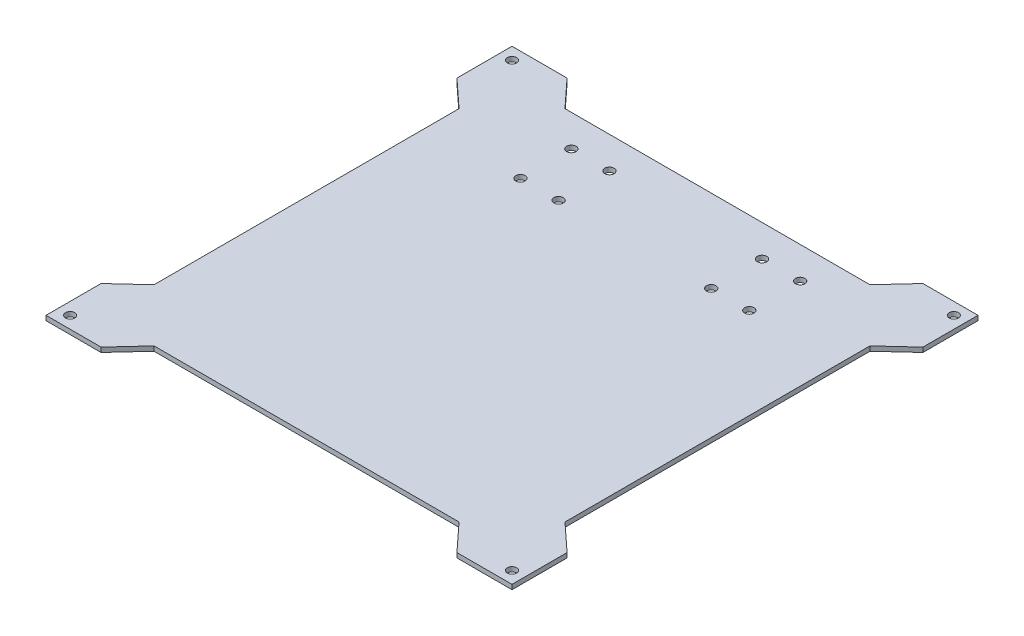
ISO-10303-21;
HEADER;
FILE_DESCRIPTION(('STEP AP214'),'2;1');
FILE_NAME('part.step','',(''),(''),'','','');
FILE_SCHEMA(('AUTOMOTIVE_DESIGN { 1 0 10303 214 1 1 1 1 }'));
ENDSEC;
DATA;
#1=APPLICATION_CONTEXT('core data for automotive mechanical design processes');
#2=APPLICATION_PROTOCOL_DEFINITION('international standard','automotive_design',2000,#1);
#3=PRODUCT_CONTEXT('',#1,'mechanical');
#4=PRODUCT('Part','Part','',(#3));
#5=PRODUCT_RELATED_PRODUCT_CATEGORY('part','',(#4));
#6=PRODUCT_DEFINITION_FORMATION('','',#4);
#7=PRODUCT_DEFINITION_CONTEXT('part definition',#1,'design');
#8=PRODUCT_DEFINITION('design','',#6,#7);
#9=PRODUCT_DEFINITION_SHAPE('','',#8);
#10=(LENGTH_UNIT() NAMED_UNIT(*) SI_UNIT(.MILLI.,.METRE.));
#11=(NAMED_UNIT(*) PLANE_ANGLE_UNIT() SI_UNIT($,.RADIAN.));
#12=(NAMED_UNIT(*) SI_UNIT($,.STERADIAN.) SOLID_ANGLE_UNIT());
#13=UNCERTAINTY_MEASURE_WITH_UNIT(LENGTH_MEASURE(1.E-05),#10,'distance_accuracy_value','');
#14=(GEOMETRIC_REPRESENTATION_CONTEXT(3) GLOBAL_UNCERTAINTY_ASSIGNED_CONTEXT((#13)) GLOBAL_UNIT_ASSIGNED_CONTEXT((#10,
#11,#12)) REPRESENTATION_CONTEXT('',''));
#15=CARTESIAN_POINT('',(0.,0.,0.));
#16=DIRECTION('',(0.,0.,1.));
#17=DIRECTION('',(1.,0.,0.));
#18=AXIS2_PLACEMENT_3D('',#15,#16,#17);
#19=CARTESIAN_POINT('',(-57.8146964856229,2.2,-53.3674121405761));
#20=DIRECTION('',(0.734803444627481,0.,0.678280102733073));
#21=DIRECTION('',(0.678280102733073,0.,-0.734803444627481));
#22=AXIS2_PLACEMENT_3D('',#19,#20,#21);
#23=PLANE('',#22);
#24=DIRECTION('',(-0.678280102733073,0.,0.734803444627481));
#25=VECTOR('',#24,1.);
#26=CARTESIAN_POINT('',(-57.8146964856229,0.,-53.3674121405761));
#27=LINE('',#26,#25);
#28=CARTESIAN_POINT('',(84.0000000000012,0.,-206.999999999999));
#29=VERTEX_POINT('',#28);
#30=CARTESIAN_POINT('',(72.0000000000011,0.,-193.999999999999));
#31=VERTEX_POINT('',#30);
#32=EDGE_CURVE('E231',#29,#31,#27,.T.);
#33=ORIENTED_EDGE('',*,*,#32,.T.);
#34=DIRECTION('',(0.,-1.,0.));
#35=VECTOR('',#34,1.);
#36=CARTESIAN_POINT('',(72.0000000000011,2.2,-193.999999999999));
#37=LINE('',#36,#35);
#38=CARTESIAN_POINT('',(72.0000000000011,2.2,-193.999999999999));
#39=VERTEX_POINT('',#38);
#40=EDGE_CURVE('E11',#39,#31,#37,.T.);
#41=ORIENTED_EDGE('',*,*,#40,.F.);
#42=DIRECTION('',(-0.678280102733073,0.,0.734803444627481));
#43=VECTOR('',#42,1.);
#44=CARTESIAN_POINT('',(-57.8146964856229,2.2,-53.3674121405761));
#45=LINE('',#44,#43);
#46=CARTESIAN_POINT('',(84.0000000000012,2.2,-206.999999999999));
#47=VERTEX_POINT('',#46);
#48=EDGE_CURVE('E428',#47,#39,#45,.T.);
#49=ORIENTED_EDGE('',*,*,#48,.F.);
#50=DIRECTION('',(0.,-1.,0.));
#51=VECTOR('',#50,1.);
#52=CARTESIAN_POINT('',(84.0000000000012,2.2,-206.999999999999));
#53=LINE('',#52,#51);
#54=EDGE_CURVE('E210',#47,#29,#53,.T.);
#55=ORIENTED_EDGE('',*,*,#54,.T.);
#56=EDGE_LOOP('',(#33,#41,#49,#55));
#57=FACE_BOUND('',#56,.T.);
#58=ADVANCED_FACE('F40',(#57),#23,.F.);
#59=CARTESIAN_POINT('',(2.09400398255688E-12,2.2,-194.));
#60=DIRECTION('',(0.,0.,1.));
#61=DIRECTION('',(1.,0.,0.));
#62=AXIS2_PLACEMENT_3D('',#59,#60,#61);
#63=PLANE('',#62);
#64=DIRECTION('',(-1.,0.,0.));
#65=VECTOR('',#64,1.);
#66=CARTESIAN_POINT('',(2.09400398255688E-12,0.,-194.));
#67=LINE('',#66,#65);
#68=CARTESIAN_POINT('',(-71.9999999999993,0.,-194.000000000001));
#69=VERTEX_POINT('',#68);
#70=EDGE_CURVE('E235',#31,#69,#67,.T.);
#71=ORIENTED_EDGE('',*,*,#70,.T.);
#72=DIRECTION('',(0.,-1.,0.));
#73=VECTOR('',#72,1.);
#74=CARTESIAN_POINT('',(-71.9999999999993,2.2,-194.000000000001));
#75=LINE('',#74,#73);
#76=CARTESIAN_POINT('',(-71.9999999999993,2.2,-194.000000000001));
#77=VERTEX_POINT('',#76);
#78=EDGE_CURVE('E50',#77,#69,#75,.T.);
#79=ORIENTED_EDGE('',*,*,#78,.F.);
#80=DIRECTION('',(-1.,0.,0.));
#81=VECTOR('',#80,1.);
#82=CARTESIAN_POINT('',(2.09400398255688E-12,2.2,-194.));
#83=LINE('',#82,#81);
#84=EDGE_CURVE('E137',#39,#77,#83,.T.);
#85=ORIENTED_EDGE('',*,*,#84,.F.);
#86=ORIENTED_EDGE('',*,*,#40,.T.);
#87=EDGE_LOOP('',(#71,#79,#85,#86));
#88=FACE_BOUND('',#87,.T.);
#89=ADVANCED_FACE('F443',(#88),#63,.F.);
#90=CARTESIAN_POINT('',(57.814696485623,2.2,-53.3674121405743));
#91=DIRECTION('',(-0.734803444627493,0.,0.67828010273306));
#92=DIRECTION('',(0.67828010273306,0.,0.734803444627493));
#93=AXIS2_PLACEMENT_3D('',#90,#91,#92);
#94=PLANE('',#93);
#95=DIRECTION('',(-0.67828010273306,0.,-0.734803444627493));
#96=VECTOR('',#95,1.);
#97=CARTESIAN_POINT('',(57.814696485623,0.,-53.3674121405743));
#98=LINE('',#97,#96);
#99=CARTESIAN_POINT('',(-83.9999999999992,0.,-207.000000000001));
#100=VERTEX_POINT('',#99);
#101=EDGE_CURVE('E238',#69,#100,#98,.T.);
#102=ORIENTED_EDGE('',*,*,#101,.T.);
#103=DIRECTION('',(0.,-1.,0.));
#104=VECTOR('',#103,1.);
#105=CARTESIAN_POINT('',(-83.9999999999992,2.2,-207.000000000001));
#106=LINE('',#105,#104);
#107=CARTESIAN_POINT('',(-83.9999999999992,2.2,-207.000000000001));
#108=VERTEX_POINT('',#107);
#109=EDGE_CURVE('E348',#108,#100,#106,.T.);
#110=ORIENTED_EDGE('',*,*,#109,.F.);
#111=DIRECTION('',(-0.67828010273306,0.,-0.734803444627493));
#112=VECTOR('',#111,1.);
#113=CARTESIAN_POINT('',(57.814696485623,2.2,-53.3674121405743));
#114=LINE('',#113,#112);
#115=EDGE_CURVE('E358',#77,#108,#114,.T.);
#116=ORIENTED_EDGE('',*,*,#115,.F.);
#117=ORIENTED_EDGE('',*,*,#78,.T.);
#118=EDGE_LOOP('',(#102,#110,#116,#117));
#119=FACE_BOUND('',#118,.T.);
#120=ADVANCED_FACE('F356',(#119),#94,.F.);
#121=CARTESIAN_POINT('',(1.32586249671581E-12,2.2,-207.));
#122=DIRECTION('',(0.,0.,1.));
#123=DIRECTION('',(1.,0.,0.));
#124=AXIS2_PLACEMENT_3D('',#121,#122,#123);
#125=PLANE('',#124);
#126=DIRECTION('',(-1.,0.,0.));
#127=VECTOR('',#126,1.);
#128=CARTESIAN_POINT('',(1.32586249671581E-12,0.,-207.));
#129=LINE('',#128,#127);
#130=CARTESIAN_POINT('',(-109.999999999999,0.,-207.000000000001));
#131=VERTEX_POINT('',#130);
#132=EDGE_CURVE('E241',#100,#131,#129,.T.);
#133=ORIENTED_EDGE('',*,*,#132,.T.);
#134=DIRECTION('',(0.,-1.,0.));
#135=VECTOR('',#134,1.);
#136=CARTESIAN_POINT('',(-109.999999999999,2.2,-207.000000000001));
#137=LINE('',#136,#135);
#138=CARTESIAN_POINT('',(-109.999999999999,2.2,-207.000000000001));
#139=VERTEX_POINT('',#138);
#140=EDGE_CURVE('E344',#139,#131,#137,.T.);
#141=ORIENTED_EDGE('',*,*,#140,.F.);
#142=DIRECTION('',(-1.,0.,0.));
#143=VECTOR('',#142,1.);
#144=CARTESIAN_POINT('',(1.32586249671581E-12,2.2,-207.));
#145=LINE('',#144,#143);
#146=EDGE_CURVE('E377',#108,#139,#145,.T.);
#147=ORIENTED_EDGE('',*,*,#146,.F.);
#148=ORIENTED_EDGE('',*,*,#109,.T.);
#149=EDGE_LOOP('',(#133,#141,#147,#148));
#150=FACE_BOUND('',#149,.T.);
#151=ADVANCED_FACE('F367',(#150),#125,.F.);
#152=CARTESIAN_POINT('',(-110.000000000001,2.2,-8.21992047078247E-13));
#153=DIRECTION('',(1.,0.,0.));
#154=DIRECTION('',(0.,0.,-1.));
#155=AXIS2_PLACEMENT_3D('',#152,#153,#154);
#156=PLANE('',#155);
#157=DIRECTION('',(0.,0.,1.));
#158=VECTOR('',#157,1.);
#159=CARTESIAN_POINT('',(-110.000000000001,0.,-8.21992047078247E-13));
#160=LINE('',#159,#158);
#161=CARTESIAN_POINT('',(-109.999999999999,0.,-181.000000000001));
#162=VERTEX_POINT('',#161);
#163=EDGE_CURVE('E244',#131,#162,#160,.T.);
#164=ORIENTED_EDGE('',*,*,#163,.T.);
#165=DIRECTION('',(0.,-1.,0.));
#166=VECTOR('',#165,1.);
#167=CARTESIAN_POINT('',(-109.999999999999,2.2,-181.000000000001));
#168=LINE('',#167,#166);
#169=CARTESIAN_POINT('',(-109.999999999999,2.2,-181.000000000001));
#170=VERTEX_POINT('',#169);
#171=EDGE_CURVE('E340',#170,#162,#168,.T.);
#172=ORIENTED_EDGE('',*,*,#171,.F.);
#173=DIRECTION('',(0.,0.,1.));
#174=VECTOR('',#173,1.);
#175=CARTESIAN_POINT('',(-110.000000000001,2.2,-8.21992047078247E-13));
#176=LINE('',#175,#174);
#177=EDGE_CURVE('E373',#139,#170,#176,.T.);
#178=ORIENTED_EDGE('',*,*,#177,.F.);
#179=ORIENTED_EDGE('',*,*,#140,.T.);
#180=EDGE_LOOP('',(#164,#172,#178,#179));
#181=FACE_BOUND('',#180,.T.);
#182=ADVANCED_FACE('F371',(#181),#156,.F.);
#183=CARTESIAN_POINT('',(39.6038338658147,2.2,-42.9041533546319));
#184=DIRECTION('',(0.678280102733071,0.,-0.734803444627483));
#185=DIRECTION('',(-0.734803444627483,0.,-0.678280102733071));
#186=AXIS2_PLACEMENT_3D('',#183,#184,#185);
#187=PLANE('',#186);
#188=DIRECTION('',(0.734803444627483,0.,0.678280102733071));
#189=VECTOR('',#188,1.);
#190=CARTESIAN_POINT('',(39.6038338658147,0.,-42.9041533546319));
#191=LINE('',#190,#189);
#192=CARTESIAN_POINT('',(-96.9999999999995,0.,-169.000000000001));
#193=VERTEX_POINT('',#192);
#194=EDGE_CURVE('E247',#162,#193,#191,.T.);
#195=ORIENTED_EDGE('',*,*,#194,.T.);
#196=DIRECTION('',(0.,-1.,0.));
#197=VECTOR('',#196,1.);
#198=CARTESIAN_POINT('',(-96.9999999999995,2.2,-169.000000000001));
#199=LINE('',#198,#197);
#200=CARTESIAN_POINT('',(-96.9999999999995,2.2,-169.000000000001));
#201=VERTEX_POINT('',#200);
#202=EDGE_CURVE('E336',#201,#193,#199,.T.);
#203=ORIENTED_EDGE('',*,*,#202,.F.);
#204=DIRECTION('',(0.734803444627483,0.,0.678280102733071));
#205=VECTOR('',#204,1.);
#206=CARTESIAN_POINT('',(39.6038338658147,2.2,-42.9041533546319));
#207=LINE('',#206,#205);
#208=EDGE_CURVE('E376',#170,#201,#207,.T.);
#209=ORIENTED_EDGE('',*,*,#208,.F.);
#210=ORIENTED_EDGE('',*,*,#171,.T.);
#211=EDGE_LOOP('',(#195,#203,#209,#210));
#212=FACE_BOUND('',#211,.T.);
#213=ADVANCED_FACE('F836',(#212),#187,.F.);
#214=CARTESIAN_POINT('',(-97.0000000000007,2.2,-6.91769172808975E-13));
#215=DIRECTION('',(1.,0.,0.));
#216=DIRECTION('',(0.,0.,-1.));
#217=AXIS2_PLACEMENT_3D('',#214,#215,#216);
#218=PLANE('',#217);
#219=DIRECTION('',(0.,0.,1.));
#220=VECTOR('',#219,1.);
#221=CARTESIAN_POINT('',(-97.0000000000007,0.,-6.91769172808975E-13));
#222=LINE('',#221,#220);
#223=CARTESIAN_POINT('',(-97.0000000000002,0.,-25.0000000000004));
#224=VERTEX_POINT('',#223);
#225=EDGE_CURVE('E250',#193,#224,#222,.T.);
#226=ORIENTED_EDGE('',*,*,#225,.T.);
#227=DIRECTION('',(0.,-1.,0.));
#228=VECTOR('',#227,1.);
#229=CARTESIAN_POINT('',(-97.0000000000002,2.2,-25.0000000000004));
#230=LINE('',#229,#228);
#231=CARTESIAN_POINT('',(-97.0000000000002,2.2,-25.0000000000004));
#232=VERTEX_POINT('',#231);
#233=EDGE_CURVE('E332',#232,#224,#230,.T.);
#234=ORIENTED_EDGE('',*,*,#233,.F.);
#235=DIRECTION('',(0.,0.,1.));
#236=VECTOR('',#235,1.);
#237=CARTESIAN_POINT('',(-97.0000000000007,2.2,-6.91769172808975E-13));
#238=LINE('',#237,#236);
#239=EDGE_CURVE('E381',#201,#232,#238,.T.);
#240=ORIENTED_EDGE('',*,*,#239,.F.);
#241=ORIENTED_EDGE('',*,*,#202,.T.);
#242=EDGE_LOOP('',(#226,#234,#240,#241));
#243=FACE_BOUND('',#242,.T.);
#244=ADVANCED_FACE('F826',(#243),#218,.F.);
#245=CARTESIAN_POINT('',(-57.0862619808307,2.2,-61.8434504792336));
#246=DIRECTION('',(0.678280102733064,0.,0.73480344462749));
#247=DIRECTION('',(0.73480344462749,0.,-0.678280102733064));
#248=AXIS2_PLACEMENT_3D('',#245,#246,#247);
#249=PLANE('',#248);
#250=DIRECTION('',(-0.73480344462749,0.,0.678280102733064));
#251=VECTOR('',#250,1.);
#252=CARTESIAN_POINT('',(-57.0862619808307,0.,-61.8434504792336));
#253=LINE('',#252,#251);
#254=CARTESIAN_POINT('',(-110.,0.,-13.0000000000004));
#255=VERTEX_POINT('',#254);
#256=EDGE_CURVE('E253',#224,#255,#253,.T.);
#257=ORIENTED_EDGE('',*,*,#256,.T.);
#258=DIRECTION('',(0.,-1.,0.));
#259=VECTOR('',#258,1.);
#260=CARTESIAN_POINT('',(-110.,2.2,-13.0000000000004));
#261=LINE('',#260,#259);
#262=CARTESIAN_POINT('',(-110.,2.2,-13.0000000000004));
#263=VERTEX_POINT('',#262);
#264=EDGE_CURVE('E328',#263,#255,#261,.T.);
#265=ORIENTED_EDGE('',*,*,#264,.F.);
#266=DIRECTION('',(-0.73480344462749,0.,0.678280102733064));
#267=VECTOR('',#266,1.);
#268=CARTESIAN_POINT('',(-57.0862619808307,2.2,-61.8434504792336));
#269=LINE('',#268,#267);
#270=EDGE_CURVE('E388',#232,#263,#269,.T.);
#271=ORIENTED_EDGE('',*,*,#270,.F.);
#272=ORIENTED_EDGE('',*,*,#233,.T.);
#273=EDGE_LOOP('',(#257,#265,#271,#272));
#274=FACE_BOUND('',#273,.T.);
#275=ADVANCED_FACE('F816',(#274),#249,.F.);
#276=CARTESIAN_POINT('',(-110.,2.2,-4.10996023539122E-13));
#277=DIRECTION('',(1.,0.,0.));
#278=DIRECTION('',(0.,0.,-1.));
#279=AXIS2_PLACEMENT_3D('',#276,#277,#278);
#280=PLANE('',#279);
#281=DIRECTION('',(0.,0.,1.));
#282=VECTOR('',#281,1.);
#283=CARTESIAN_POINT('',(-110.,0.,-4.10996023539122E-13));
#284=LINE('',#283,#282);
#285=CARTESIAN_POINT('',(-110.,0.,12.9999999999996));
#286=VERTEX_POINT('',#285);
#287=EDGE_CURVE('E256',#255,#286,#284,.T.);
#288=ORIENTED_EDGE('',*,*,#287,.T.);
#289=DIRECTION('',(0.,-1.,0.));
#290=VECTOR('',#289,1.);
#291=CARTESIAN_POINT('',(-110.,2.2,12.9999999999996));
#292=LINE('',#291,#290);
#293=CARTESIAN_POINT('',(-110.,2.2,12.9999999999996));
#294=VERTEX_POINT('',#293);
#295=EDGE_CURVE('E324',#294,#286,#292,.T.);
#296=ORIENTED_EDGE('',*,*,#295,.F.);
#297=DIRECTION('',(0.,0.,1.));
#298=VECTOR('',#297,1.);
#299=CARTESIAN_POINT('',(-110.,2.2,-4.10996023539122E-13));
#300=LINE('',#299,#298);
#301=EDGE_CURVE('E391',#263,#294,#300,.T.);
#302=ORIENTED_EDGE('',*,*,#301,.F.);
#303=ORIENTED_EDGE('',*,*,#264,.T.);
#304=EDGE_LOOP('',(#288,#296,#302,#303));
#305=FACE_BOUND('',#304,.T.);
#306=ADVANCED_FACE('F806',(#305),#280,.F.);
#307=CARTESIAN_POINT('',(0.,2.2,13.));
#308=DIRECTION('',(0.,0.,-1.));
#309=DIRECTION('',(-1.,0.,0.));
#310=AXIS2_PLACEMENT_3D('',#307,#308,#309);
#311=PLANE('',#310);
#312=DIRECTION('',(1.,0.,0.));
#313=VECTOR('',#312,1.);
#314=CARTESIAN_POINT('',(0.,0.,13.));
#315=LINE('',#314,#313);
#316=CARTESIAN_POINT('',(-84.0000000000004,0.,12.9999999999997));
#317=VERTEX_POINT('',#316);
#318=EDGE_CURVE('E259',#286,#317,#315,.T.);
#319=ORIENTED_EDGE('',*,*,#318,.T.);
#320=DIRECTION('',(0.,-1.,0.));
#321=VECTOR('',#320,1.);
#322=CARTESIAN_POINT('',(-84.0000000000004,2.2,12.9999999999997));
#323=LINE('',#322,#321);
#324=CARTESIAN_POINT('',(-84.0000000000004,2.2,12.9999999999997));
#325=VERTEX_POINT('',#324);
#326=EDGE_CURVE('E320',#325,#317,#323,.T.);
#327=ORIENTED_EDGE('',*,*,#326,.F.);
#328=DIRECTION('',(1.,0.,0.));
#329=VECTOR('',#328,1.);
#330=CARTESIAN_POINT('',(0.,2.2,13.));
#331=LINE('',#330,#329);
#332=EDGE_CURVE('E394',#294,#325,#331,.T.);
#333=ORIENTED_EDGE('',*,*,#332,.F.);
#334=ORIENTED_EDGE('',*,*,#295,.T.);
#335=EDGE_LOOP('',(#319,#327,#333,#334));
#336=FACE_BOUND('',#335,.T.);
#337=ADVANCED_FACE('F796',(#336),#311,.F.);
#338=CARTESIAN_POINT('',(-38.8753993610223,2.2,-35.8849840255594));
#339=DIRECTION('',(-0.734803444627485,0.,-0.678280102733069));
#340=DIRECTION('',(-0.678280102733069,0.,0.734803444627485));
#341=AXIS2_PLACEMENT_3D('',#338,#339,#340);
#342=PLANE('',#341);
#343=DIRECTION('',(0.678280102733069,0.,-0.734803444627485));
#344=VECTOR('',#343,1.);
#345=CARTESIAN_POINT('',(-38.8753993610223,0.,-35.8849840255594));
#346=LINE('',#345,#344);
#347=CARTESIAN_POINT('',(-72.0000000000003,0.,-2.63677968348475E-13));
#348=VERTEX_POINT('',#347);
#349=EDGE_CURVE('E262',#317,#348,#346,.T.);
#350=ORIENTED_EDGE('',*,*,#349,.T.);
#351=DIRECTION('',(0.,-1.,0.));
#352=VECTOR('',#351,1.);
#353=CARTESIAN_POINT('',(-72.0000000000003,2.2,-2.63677968348475E-13));
#354=LINE('',#353,#352);
#355=CARTESIAN_POINT('',(-72.0000000000003,2.2,-2.63677968348475E-13));
#356=VERTEX_POINT('',#355);
#357=EDGE_CURVE('E316',#356,#348,#354,.T.);
#358=ORIENTED_EDGE('',*,*,#357,.F.);
#359=DIRECTION('',(0.678280102733069,0.,-0.734803444627485));
#360=VECTOR('',#359,1.);
#361=CARTESIAN_POINT('',(-38.8753993610223,2.2,-35.8849840255594));
#362=LINE('',#361,#360);
#363=EDGE_CURVE('E397',#325,#356,#362,.T.);
#364=ORIENTED_EDGE('',*,*,#363,.F.);
#365=ORIENTED_EDGE('',*,*,#326,.T.);
#366=EDGE_LOOP('',(#350,#358,#364,#365));
#367=FACE_BOUND('',#366,.T.);
#368=ADVANCED_FACE('F785',(#367),#342,.F.);
#369=CARTESIAN_POINT('',(0.,2.2,0.));
#370=DIRECTION('',(0.,0.,-1.));
#371=DIRECTION('',(-1.,0.,0.));
#372=AXIS2_PLACEMENT_3D('',#369,#370,#371);
#373=PLANE('',#372);
#374=DIRECTION('',(1.,0.,0.));
#375=VECTOR('',#374,1.);
#376=CARTESIAN_POINT('',(0.,0.,0.));
#377=LINE('',#376,#375);
#378=CARTESIAN_POINT('',(72.,0.,0.));
#379=VERTEX_POINT('',#378);
#380=EDGE_CURVE('E265',#348,#379,#377,.T.);
#381=ORIENTED_EDGE('',*,*,#380,.T.);
#382=DIRECTION('',(0.,-1.,0.));
#383=VECTOR('',#382,1.);
#384=CARTESIAN_POINT('',(72.,2.2,0.));
#385=LINE('',#384,#383);
#386=CARTESIAN_POINT('',(72.,2.2,0.));
#387=VERTEX_POINT('',#386);
#388=EDGE_CURVE('E312',#387,#379,#385,.T.);
#389=ORIENTED_EDGE('',*,*,#388,.F.);
#390=DIRECTION('',(1.,0.,0.));
#391=VECTOR('',#390,1.);
#392=CARTESIAN_POINT('',(0.,2.2,0.));
#393=LINE('',#392,#391);
#394=EDGE_CURVE('E400',#356,#387,#393,.T.);
#395=ORIENTED_EDGE('',*,*,#394,.F.);
#396=ORIENTED_EDGE('',*,*,#357,.T.);
#397=EDGE_LOOP('',(#381,#389,#395,#396));
#398=FACE_BOUND('',#397,.T.);
#399=ADVANCED_FACE('F775',(#398),#373,.F.);
#400=CARTESIAN_POINT('',(38.8753993610223,2.2,-35.8849840255591));
#401=DIRECTION('',(0.734803444627488,0.,-0.678280102733066));
#402=DIRECTION('',(-0.678280102733066,0.,-0.734803444627488));
#403=AXIS2_PLACEMENT_3D('',#400,#401,#402);
#404=PLANE('',#403);
#405=DIRECTION('',(0.678280102733066,0.,0.734803444627488));
#406=VECTOR('',#405,1.);
#407=CARTESIAN_POINT('',(38.8753993610223,0.,-35.8849840255591));
#408=LINE('',#407,#406);
#409=CARTESIAN_POINT('',(84.,0.,13.));
#410=VERTEX_POINT('',#409);
#411=EDGE_CURVE('E268',#379,#410,#408,.T.);
#412=ORIENTED_EDGE('',*,*,#411,.T.);
#413=DIRECTION('',(0.,-1.,0.));
#414=VECTOR('',#413,1.);
#415=CARTESIAN_POINT('',(84.,2.2,13.));
#416=LINE('',#415,#414);
#417=CARTESIAN_POINT('',(84.,2.2,13.));
#418=VERTEX_POINT('',#417);
#419=EDGE_CURVE('E308',#418,#410,#416,.T.);
#420=ORIENTED_EDGE('',*,*,#419,.F.);
#421=DIRECTION('',(0.678280102733066,0.,0.734803444627488));
#422=VECTOR('',#421,1.);
#423=CARTESIAN_POINT('',(38.8753993610223,2.2,-35.8849840255591));
#424=LINE('',#423,#422);
#425=EDGE_CURVE('E403',#387,#418,#424,.T.);
#426=ORIENTED_EDGE('',*,*,#425,.F.);
#427=ORIENTED_EDGE('',*,*,#388,.T.);
#428=EDGE_LOOP('',(#412,#420,#426,#427));
#429=FACE_BOUND('',#428,.T.);
#430=ADVANCED_FACE('F765',(#429),#404,.F.);
#431=CARTESIAN_POINT('',(0.,2.2,13.));
#432=DIRECTION('',(0.,0.,-1.));
#433=DIRECTION('',(-1.,0.,0.));
#434=AXIS2_PLACEMENT_3D('',#431,#432,#433);
#435=PLANE('',#434);
#436=DIRECTION('',(1.,0.,0.));
#437=VECTOR('',#436,1.);
#438=CARTESIAN_POINT('',(0.,0.,13.));
#439=LINE('',#438,#437);
#440=CARTESIAN_POINT('',(110.,0.,13.));
#441=VERTEX_POINT('',#440);
#442=EDGE_CURVE('E271',#410,#441,#439,.T.);
#443=ORIENTED_EDGE('',*,*,#442,.T.);
#444=DIRECTION('',(0.,-1.,0.));
#445=VECTOR('',#444,1.);
#446=CARTESIAN_POINT('',(110.,2.2,13.));
#447=LINE('',#446,#445);
#448=CARTESIAN_POINT('',(110.,2.2,13.));
#449=VERTEX_POINT('',#448);
#450=EDGE_CURVE('E304',#449,#441,#447,.T.);
#451=ORIENTED_EDGE('',*,*,#450,.F.);
#452=DIRECTION('',(1.,0.,0.));
#453=VECTOR('',#452,1.);
#454=CARTESIAN_POINT('',(0.,2.2,13.));
#455=LINE('',#454,#453);
#456=EDGE_CURVE('E406',#418,#449,#455,.T.);
#457=ORIENTED_EDGE('',*,*,#456,.F.);
#458=ORIENTED_EDGE('',*,*,#419,.T.);
#459=EDGE_LOOP('',(#443,#451,#457,#458));
#460=FACE_BOUND('',#459,.T.);
#461=ADVANCED_FACE('F755',(#460),#435,.F.);
#462=CARTESIAN_POINT('',(110.,2.2,0.));
#463=DIRECTION('',(-1.,0.,0.));
#464=DIRECTION('',(0.,0.,1.));
#465=AXIS2_PLACEMENT_3D('',#462,#463,#464);
#466=PLANE('',#465);
#467=DIRECTION('',(0.,0.,-1.));
#468=VECTOR('',#467,1.);
#469=CARTESIAN_POINT('',(110.,0.,0.));
#470=LINE('',#469,#468);
#471=CARTESIAN_POINT('',(110.,0.,-13.));
#472=VERTEX_POINT('',#471);
#473=EDGE_CURVE('E274',#441,#472,#470,.T.);
#474=ORIENTED_EDGE('',*,*,#473,.T.);
#475=DIRECTION('',(0.,-1.,0.));
#476=VECTOR('',#475,1.);
#477=CARTESIAN_POINT('',(110.,2.2,-13.));
#478=LINE('',#477,#476);
#479=CARTESIAN_POINT('',(110.,2.2,-13.));
#480=VERTEX_POINT('',#479);
#481=EDGE_CURVE('E300',#480,#472,#478,.T.);
#482=ORIENTED_EDGE('',*,*,#481,.F.);
#483=DIRECTION('',(0.,0.,-1.));
#484=VECTOR('',#483,1.);
#485=CARTESIAN_POINT('',(110.,2.2,0.));
#486=LINE('',#485,#484);
#487=EDGE_CURVE('E409',#449,#480,#486,.T.);
#488=ORIENTED_EDGE('',*,*,#487,.F.);
#489=ORIENTED_EDGE('',*,*,#450,.T.);
#490=EDGE_LOOP('',(#474,#482,#488,#489));
#491=FACE_BOUND('',#490,.T.);
#492=ADVANCED_FACE('F746',(#491),#466,.F.);
#493=CARTESIAN_POINT('',(57.0862619808307,2.2,-61.8434504792332));
#494=DIRECTION('',(-0.678280102733066,0.,0.734803444627488));
#495=DIRECTION('',(0.734803444627488,0.,0.678280102733066));
#496=AXIS2_PLACEMENT_3D('',#493,#494,#495);
#497=PLANE('',#496);
#498=DIRECTION('',(-0.734803444627488,0.,-0.678280102733066));
#499=VECTOR('',#498,1.);
#500=CARTESIAN_POINT('',(57.0862619808307,0.,-61.8434504792332));
#501=LINE('',#500,#499);
#502=CARTESIAN_POINT('',(97.,0.,-25.));
#503=VERTEX_POINT('',#502);
#504=EDGE_CURVE('E277',#472,#503,#501,.T.);
#505=ORIENTED_EDGE('',*,*,#504,.T.);
#506=DIRECTION('',(0.,-1.,0.));
#507=VECTOR('',#506,1.);
#508=CARTESIAN_POINT('',(97.,2.2,-25.));
#509=LINE('',#508,#507);
#510=CARTESIAN_POINT('',(97.,2.2,-25.));
#511=VERTEX_POINT('',#510);
#512=EDGE_CURVE('E296',#511,#503,#509,.T.);
#513=ORIENTED_EDGE('',*,*,#512,.F.);
#514=DIRECTION('',(-0.734803444627488,0.,-0.678280102733066));
#515=VECTOR('',#514,1.);
#516=CARTESIAN_POINT('',(57.0862619808307,2.2,-61.8434504792332));
#517=LINE('',#516,#515);
#518=EDGE_CURVE('E412',#480,#511,#517,.T.);
#519=ORIENTED_EDGE('',*,*,#518,.F.);
#520=ORIENTED_EDGE('',*,*,#481,.T.);
#521=EDGE_LOOP('',(#505,#513,#519,#520));
#522=FACE_BOUND('',#521,.T.);
#523=ADVANCED_FACE('F420',(#522),#497,.F.);
#524=CARTESIAN_POINT('',(97.,2.2,0.));
#525=DIRECTION('',(-1.,0.,0.));
#526=DIRECTION('',(0.,0.,1.));
#527=AXIS2_PLACEMENT_3D('',#524,#525,#526);
#528=PLANE('',#527);
#529=DIRECTION('',(0.,0.,-1.));
#530=VECTOR('',#529,1.);
#531=CARTESIAN_POINT('',(97.,0.,0.));
#532=LINE('',#531,#530);
#533=CARTESIAN_POINT('',(97.0000000000008,0.,-168.999999999999));
#534=VERTEX_POINT('',#533);
#535=EDGE_CURVE('E280',#503,#534,#532,.T.);
#536=ORIENTED_EDGE('',*,*,#535,.T.);
#537=DIRECTION('',(0.,-1.,0.));
#538=VECTOR('',#537,1.);
#539=CARTESIAN_POINT('',(97.0000000000008,2.2,-168.999999999999));
#540=LINE('',#539,#538);
#541=CARTESIAN_POINT('',(97.0000000000008,2.2,-168.999999999999));
#542=VERTEX_POINT('',#541);
#543=EDGE_CURVE('E203',#542,#534,#540,.T.);
#544=ORIENTED_EDGE('',*,*,#543,.F.);
#545=DIRECTION('',(0.,0.,-1.));
#546=VECTOR('',#545,1.);
#547=CARTESIAN_POINT('',(97.,2.2,0.));
#548=LINE('',#547,#546);
#549=EDGE_CURVE('E192',#511,#542,#548,.T.);
#550=ORIENTED_EDGE('',*,*,#549,.F.);
#551=ORIENTED_EDGE('',*,*,#512,.T.);
#552=EDGE_LOOP('',(#536,#544,#550,#551));
#553=FACE_BOUND('',#552,.T.);
#554=ADVANCED_FACE('F424',(#553),#528,.F.);
#555=CARTESIAN_POINT('',(-39.6038338658148,2.2,-42.9041533546337));
#556=DIRECTION('',(-0.678280102733057,0.,-0.734803444627496));
#557=DIRECTION('',(-0.734803444627496,0.,0.678280102733057));
#558=AXIS2_PLACEMENT_3D('',#555,#556,#557);
#559=PLANE('',#558);
#560=DIRECTION('',(0.734803444627496,0.,-0.678280102733057));
#561=VECTOR('',#560,1.);
#562=CARTESIAN_POINT('',(-39.6038338658148,0.,-42.9041533546337));
#563=LINE('',#562,#561);
#564=CARTESIAN_POINT('',(110.000000000001,0.,-180.999999999999));
#565=VERTEX_POINT('',#564);
#566=EDGE_CURVE('E201',#534,#565,#563,.T.);
#567=ORIENTED_EDGE('',*,*,#566,.T.);
#568=DIRECTION('',(0.,-1.,0.));
#569=VECTOR('',#568,1.);
#570=CARTESIAN_POINT('',(110.000000000001,2.2,-180.999999999999));
#571=LINE('',#570,#569);
#572=CARTESIAN_POINT('',(110.000000000001,2.2,-180.999999999999));
#573=VERTEX_POINT('',#572);
#574=EDGE_CURVE('E198',#573,#565,#571,.T.);
#575=ORIENTED_EDGE('',*,*,#574,.F.);
#576=DIRECTION('',(0.734803444627496,0.,-0.678280102733057));
#577=VECTOR('',#576,1.);
#578=CARTESIAN_POINT('',(-39.6038338658148,2.2,-42.9041533546337));
#579=LINE('',#578,#577);
#580=EDGE_CURVE('E186',#542,#573,#579,.T.);
#581=ORIENTED_EDGE('',*,*,#580,.F.);
#582=ORIENTED_EDGE('',*,*,#543,.T.);
#583=EDGE_LOOP('',(#567,#575,#581,#582));
#584=FACE_BOUND('',#583,.T.);
#585=ADVANCED_FACE('F199',(#584),#559,.F.);
#586=CARTESIAN_POINT('',(109.999999999999,2.2,1.11556063532046E-12));
#587=DIRECTION('',(-1.,0.,0.));
#588=DIRECTION('',(0.,0.,1.));
#589=AXIS2_PLACEMENT_3D('',#586,#587,#588);
#590=PLANE('',#589);
#591=DIRECTION('',(0.,0.,-1.));
#592=VECTOR('',#591,1.);
#593=CARTESIAN_POINT('',(109.999999999999,0.,1.11556063532046E-12));
#594=LINE('',#593,#592);
#595=CARTESIAN_POINT('',(110.000000000001,0.,-206.999999999999));
#596=VERTEX_POINT('',#595);
#597=EDGE_CURVE('E123',#565,#596,#594,.T.);
#598=ORIENTED_EDGE('',*,*,#597,.T.);
#599=DIRECTION('',(0.,-1.,0.));
#600=VECTOR('',#599,1.);
#601=CARTESIAN_POINT('',(110.000000000001,2.2,-206.999999999999));
#602=LINE('',#601,#600);
#603=CARTESIAN_POINT('',(110.000000000001,2.2,-206.999999999999));
#604=VERTEX_POINT('',#603);
#605=EDGE_CURVE('E204',#604,#596,#602,.T.);
#606=ORIENTED_EDGE('',*,*,#605,.F.);
#607=DIRECTION('',(0.,0.,-1.));
#608=VECTOR('',#607,1.);
#609=CARTESIAN_POINT('',(109.999999999999,2.2,1.11556063532046E-12));
#610=LINE('',#609,#608);
#611=EDGE_CURVE('E190',#573,#604,#610,.T.);
#612=ORIENTED_EDGE('',*,*,#611,.F.);
#613=ORIENTED_EDGE('',*,*,#574,.T.);
#614=EDGE_LOOP('',(#598,#606,#612,#613));
#615=FACE_BOUND('',#614,.T.);
#616=ADVANCED_FACE('F206',(#615),#590,.F.);
#617=CARTESIAN_POINT('',(104.3,2.2,7.3));
#618=DIRECTION('',(0.,-1.,0.));
#619=DIRECTION('',(0.,0.,-1.));
#620=AXIS2_PLACEMENT_3D('',#617,#618,#619);
#621=CYLINDRICAL_SURFACE('',#620,2.20000000000001);
#622=CARTESIAN_POINT('',(104.3,2.2,7.3));
#623=DIRECTION('',(0.,1.,0.));
#624=DIRECTION('',(0.,0.,1.));
#625=AXIS2_PLACEMENT_3D('',#622,#623,#624);
#626=CIRCLE('',#625,2.20000000000001);
#627=CARTESIAN_POINT('',(104.3,2.2,9.50000000000001));
#628=VERTEX_POINT('',#627);
#629=EDGE_CURVE('E590',#628,#628,#626,.T.);
#630=ORIENTED_EDGE('',*,*,#629,.T.);
#631=EDGE_LOOP('',(#630));
#632=FACE_BOUND('',#631,.T.);
#633=CARTESIAN_POINT('',(104.3,0.,7.3));
#634=DIRECTION('',(0.,1.,0.));
#635=DIRECTION('',(0.,0.,1.));
#636=AXIS2_PLACEMENT_3D('',#633,#634,#635);
#637=CIRCLE('',#636,2.20000000000001);
#638=CARTESIAN_POINT('',(104.3,0.,9.50000000000001));
#639=VERTEX_POINT('',#638);
#640=EDGE_CURVE('E227',#639,#639,#637,.T.);
#641=ORIENTED_EDGE('',*,*,#640,.F.);
#642=EDGE_LOOP('',(#641));
#643=FACE_BOUND('',#642,.T.);
#644=ADVANCED_FACE('F451',(#632,#643),#621,.F.);
#645=CARTESIAN_POINT('',(-104.3,2.2,7.29999999999963));
#646=DIRECTION('',(0.,-1.,0.));
#647=DIRECTION('',(0.,0.,-1.));
#648=AXIS2_PLACEMENT_3D('',#645,#646,#647);
#649=CYLINDRICAL_SURFACE('',#648,2.20000000000001);
#650=CARTESIAN_POINT('',(-104.3,2.2,7.29999999999963));
#651=DIRECTION('',(0.,1.,0.));
#652=DIRECTION('',(0.,0.,1.));
#653=AXIS2_PLACEMENT_3D('',#650,#651,#652);
#654=CIRCLE('',#653,2.20000000000001);
#655=CARTESIAN_POINT('',(-104.3,2.2,9.49999999999964));
#656=VERTEX_POINT('',#655);
#657=EDGE_CURVE('E586',#656,#656,#654,.T.);
#658=ORIENTED_EDGE('',*,*,#657,.T.);
#659=EDGE_LOOP('',(#658));
#660=FACE_BOUND('',#659,.T.);
#661=CARTESIAN_POINT('',(-104.3,0.,7.29999999999963));
#662=DIRECTION('',(0.,1.,0.));
#663=DIRECTION('',(0.,0.,1.));
#664=AXIS2_PLACEMENT_3D('',#661,#662,#663);
#665=CIRCLE('',#664,2.20000000000001);
#666=CARTESIAN_POINT('',(-104.3,0.,9.49999999999964));
#667=VERTEX_POINT('',#666);
#668=EDGE_CURVE('E223',#667,#667,#665,.T.);
#669=ORIENTED_EDGE('',*,*,#668,.F.);
#670=EDGE_LOOP('',(#669));
#671=FACE_BOUND('',#670,.T.);
#672=ADVANCED_FACE('F454',(#660,#671),#649,.F.);
#673=CARTESIAN_POINT('',(-104.299999999999,2.2,-201.300000000001));
#674=DIRECTION('',(0.,-1.,0.));
#675=DIRECTION('',(0.,0.,-1.));
#676=AXIS2_PLACEMENT_3D('',#673,#674,#675);
#677=CYLINDRICAL_SURFACE('',#676,2.20000000000002);
#678=CARTESIAN_POINT('',(-104.299999999999,2.2,-201.300000000001));
#679=DIRECTION('',(0.,1.,0.));
#680=DIRECTION('',(0.,0.,1.));
#681=AXIS2_PLACEMENT_3D('',#678,#679,#680);
#682=CIRCLE('',#681,2.20000000000002);
#683=CARTESIAN_POINT('',(-104.299999999999,2.2,-199.100000000001));
#684=VERTEX_POINT('',#683);
#685=EDGE_CURVE('E465',#684,#684,#682,.T.);
#686=ORIENTED_EDGE('',*,*,#685,.T.);
#687=EDGE_LOOP('',(#686));
#688=FACE_BOUND('',#687,.T.);
#689=CARTESIAN_POINT('',(-104.299999999999,0.,-201.300000000001));
#690=DIRECTION('',(0.,1.,0.));
#691=DIRECTION('',(0.,0.,1.));
#692=AXIS2_PLACEMENT_3D('',#689,#690,#691);
#693=CIRCLE('',#692,2.20000000000002);
#694=CARTESIAN_POINT('',(-104.299999999999,0.,-199.100000000001));
#695=VERTEX_POINT('',#694);
#696=EDGE_CURVE('E218',#695,#695,#693,.T.);
#697=ORIENTED_EDGE('',*,*,#696,.F.);
#698=EDGE_LOOP('',(#697));
#699=FACE_BOUND('',#698,.T.);
#700=ADVANCED_FACE('F438',(#688,#699),#677,.F.);
#701=CARTESIAN_POINT('',(104.300000000001,2.2,-201.299999999999));
#702=DIRECTION('',(0.,-1.,0.));
#703=DIRECTION('',(0.,0.,-1.));
#704=AXIS2_PLACEMENT_3D('',#701,#702,#703);
#705=CYLINDRICAL_SURFACE('',#704,2.20000000000001);
#706=CARTESIAN_POINT('',(104.300000000001,2.2,-201.299999999999));
#707=DIRECTION('',(0.,1.,0.));
#708=DIRECTION('',(0.,0.,1.));
#709=AXIS2_PLACEMENT_3D('',#706,#707,#708);
#710=CIRCLE('',#709,2.20000000000001);
#711=CARTESIAN_POINT('',(104.300000000001,2.2,-199.099999999999));
#712=VERTEX_POINT('',#711);
#713=EDGE_CURVE('E289',#712,#712,#710,.T.);
#714=ORIENTED_EDGE('',*,*,#713,.T.);
#715=EDGE_LOOP('',(#714));
#716=FACE_BOUND('',#715,.T.);
#717=CARTESIAN_POINT('',(104.300000000001,0.,-201.299999999999));
#718=DIRECTION('',(0.,1.,0.));
#719=DIRECTION('',(0.,0.,1.));
#720=AXIS2_PLACEMENT_3D('',#717,#718,#719);
#721=CIRCLE('',#720,2.20000000000001);
#722=CARTESIAN_POINT('',(104.300000000001,0.,-199.099999999999));
#723=VERTEX_POINT('',#722);
#724=EDGE_CURVE('E214',#723,#723,#721,.T.);
#725=ORIENTED_EDGE('',*,*,#724,.F.);
#726=EDGE_LOOP('',(#725));
#727=FACE_BOUND('',#726,.T.);
#728=ADVANCED_FACE('F42',(#716,#727),#705,.F.);
#729=CARTESIAN_POINT('',(2.20977082785969E-12,2.2,-207.));
#730=DIRECTION('',(0.,0.,1.));
#731=DIRECTION('',(1.,0.,0.));
#732=AXIS2_PLACEMENT_3D('',#729,#730,#731);
#733=PLANE('',#732);
#734=DIRECTION('',(-1.,0.,0.));
#735=VECTOR('',#734,1.);
#736=CARTESIAN_POINT('',(2.20977082785969E-12,0.,-207.));
#737=LINE('',#736,#735);
#738=EDGE_CURVE('E129',#596,#29,#737,.T.);
#739=ORIENTED_EDGE('',*,*,#738,.T.);
#740=ORIENTED_EDGE('',*,*,#54,.F.);
#741=DIRECTION('',(-1.,0.,0.));
#742=VECTOR('',#741,1.);
#743=CARTESIAN_POINT('',(2.20977082785969E-12,2.2,-207.));
#744=LINE('',#743,#742);
#745=EDGE_CURVE('E58',#604,#47,#744,.T.);
#746=ORIENTED_EDGE('',*,*,#745,.F.);
#747=ORIENTED_EDGE('',*,*,#605,.T.);
#748=EDGE_LOOP('',(#739,#740,#746,#747));
#749=FACE_BOUND('',#748,.T.);
#750=ADVANCED_FACE('F429',(#749),#733,.F.);
#751=CARTESIAN_POINT('',(0.,2.2,0.));
#752=DIRECTION('',(0.,1.,0.));
#753=DIRECTION('',(0.,0.,1.));
#754=AXIS2_PLACEMENT_3D('',#751,#752,#753);
#755=PLANE('',#754);
#756=CARTESIAN_POINT('',(36.0249999999995,2.2,-155.025));
#757=DIRECTION('',(0.,1.,0.));
#758=DIRECTION('',(0.,0.,-1.));
#759=AXIS2_PLACEMENT_3D('',#756,#757,#758);
#760=CIRCLE('',#759,2.22499999999991);
#761=CARTESIAN_POINT('',(36.0249999999995,2.2,-157.25));
#762=VERTEX_POINT('',#761);
#763=EDGE_CURVE('E532',#762,#762,#760,.T.);
#764=ORIENTED_EDGE('',*,*,#763,.F.);
#765=EDGE_LOOP('',(#764));
#766=FACE_BOUND('',#765,.T.);
#767=CARTESIAN_POINT('',(-36.0249999999995,2.2,-155.024999999999));
#768=DIRECTION('',(0.,1.,0.));
#769=DIRECTION('',(0.,0.,1.));
#770=AXIS2_PLACEMENT_3D('',#767,#768,#769);
#771=CIRCLE('',#770,2.22499999999999);
#772=CARTESIAN_POINT('',(-36.0249999999995,2.2,-152.799999999999));
#773=VERTEX_POINT('',#772);
#774=EDGE_CURVE('E549',#773,#773,#771,.T.);
#775=ORIENTED_EDGE('',*,*,#774,.F.);
#776=EDGE_LOOP('',(#775));
#777=FACE_BOUND('',#776,.T.);
#778=CARTESIAN_POINT('',(-54.0249999999995,2.2,-155.024999999999));
#779=DIRECTION('',(0.,1.,0.));
#780=DIRECTION('',(0.,0.,1.));
#781=AXIS2_PLACEMENT_3D('',#778,#779,#780);
#782=CIRCLE('',#781,2.22499999999999);
#783=CARTESIAN_POINT('',(-54.0249999999995,2.2,-152.799999999999));
#784=VERTEX_POINT('',#783);
#785=EDGE_CURVE('E548',#784,#784,#782,.T.);
#786=ORIENTED_EDGE('',*,*,#785,.F.);
#787=EDGE_LOOP('',(#786));
#788=FACE_BOUND('',#787,.T.);
#789=CARTESIAN_POINT('',(-36.0249999999995,2.2,-179.024999999999));
#790=DIRECTION('',(0.,1.,0.));
#791=DIRECTION('',(0.,0.,1.));
#792=AXIS2_PLACEMENT_3D('',#789,#790,#791);
#793=CIRCLE('',#792,2.22499999999999);
#794=CARTESIAN_POINT('',(-36.0249999999995,2.2,-176.799999999999));
#795=VERTEX_POINT('',#794);
#796=EDGE_CURVE('E564',#795,#795,#793,.T.);
#797=ORIENTED_EDGE('',*,*,#796,.F.);
#798=EDGE_LOOP('',(#797));
#799=FACE_BOUND('',#798,.T.);
#800=CARTESIAN_POINT('',(54.0249999999995,2.2,-179.025));
#801=DIRECTION('',(0.,1.,0.));
#802=DIRECTION('',(0.,0.,-1.));
#803=AXIS2_PLACEMENT_3D('',#800,#801,#802);
#804=CIRCLE('',#803,2.22499999999784);
#805=CARTESIAN_POINT('',(54.0249999999995,2.2,-181.249999999998));
#806=VERTEX_POINT('',#805);
#807=EDGE_CURVE('E520',#806,#806,#804,.T.);
#808=ORIENTED_EDGE('',*,*,#807,.F.);
#809=EDGE_LOOP('',(#808));
#810=FACE_BOUND('',#809,.T.);
#811=CARTESIAN_POINT('',(36.0249999999995,2.2,-179.024999999999));
#812=DIRECTION('',(0.,1.,0.));
#813=DIRECTION('',(0.,0.,-1.));
#814=AXIS2_PLACEMENT_3D('',#811,#812,#813);
#815=CIRCLE('',#814,2.2249999999986);
#816=CARTESIAN_POINT('',(36.0249999999995,2.2,-181.249999999998));
#817=VERTEX_POINT('',#816);
#818=EDGE_CURVE('E525',#817,#817,#815,.T.);
#819=ORIENTED_EDGE('',*,*,#818,.F.);
#820=EDGE_LOOP('',(#819));
#821=FACE_BOUND('',#820,.T.);
#822=CARTESIAN_POINT('',(54.0249999999995,2.2,-155.025));
#823=DIRECTION('',(0.,1.,0.));
#824=DIRECTION('',(0.,0.,-1.));
#825=AXIS2_PLACEMENT_3D('',#822,#823,#824);
#826=CIRCLE('',#825,2.22499999999952);
#827=CARTESIAN_POINT('',(54.0249999999995,2.2,-157.25));
#828=VERTEX_POINT('',#827);
#829=EDGE_CURVE('E533',#828,#828,#826,.T.);
#830=ORIENTED_EDGE('',*,*,#829,.F.);
#831=EDGE_LOOP('',(#830));
#832=FACE_BOUND('',#831,.T.);
#833=CARTESIAN_POINT('',(-54.0249999999995,2.2,-179.024999999999));
#834=DIRECTION('',(0.,1.,0.));
#835=DIRECTION('',(0.,0.,1.));
#836=AXIS2_PLACEMENT_3D('',#833,#834,#835);
#837=CIRCLE('',#836,2.22499999999999);
#838=CARTESIAN_POINT('',(-54.0249999999995,2.2,-176.799999999999));
#839=VERTEX_POINT('',#838);
#840=EDGE_CURVE('E563',#839,#839,#837,.T.);
#841=ORIENTED_EDGE('',*,*,#840,.F.);
#842=EDGE_LOOP('',(#841));
#843=FACE_BOUND('',#842,.T.);
#844=ORIENTED_EDGE('',*,*,#713,.F.);
#845=EDGE_LOOP('',(#844));
#846=FACE_BOUND('',#845,.T.);
#847=ORIENTED_EDGE('',*,*,#685,.F.);
#848=EDGE_LOOP('',(#847));
#849=FACE_BOUND('',#848,.T.);
#850=ORIENTED_EDGE('',*,*,#657,.F.);
#851=EDGE_LOOP('',(#850));
#852=FACE_BOUND('',#851,.T.);
#853=ORIENTED_EDGE('',*,*,#629,.F.);
#854=EDGE_LOOP('',(#853));
#855=FACE_BOUND('',#854,.T.);
#856=ORIENTED_EDGE('',*,*,#48,.T.);
#857=ORIENTED_EDGE('',*,*,#84,.T.);
#858=ORIENTED_EDGE('',*,*,#115,.T.);
#859=ORIENTED_EDGE('',*,*,#146,.T.);
#860=ORIENTED_EDGE('',*,*,#177,.T.);
#861=ORIENTED_EDGE('',*,*,#208,.T.);
#862=ORIENTED_EDGE('',*,*,#239,.T.);
#863=ORIENTED_EDGE('',*,*,#270,.T.);
#864=ORIENTED_EDGE('',*,*,#301,.T.);
#865=ORIENTED_EDGE('',*,*,#332,.T.);
#866=ORIENTED_EDGE('',*,*,#363,.T.);
#867=ORIENTED_EDGE('',*,*,#394,.T.);
#868=ORIENTED_EDGE('',*,*,#425,.T.);
#869=ORIENTED_EDGE('',*,*,#456,.T.);
#870=ORIENTED_EDGE('',*,*,#487,.T.);
#871=ORIENTED_EDGE('',*,*,#518,.T.);
#872=ORIENTED_EDGE('',*,*,#549,.T.);
#873=ORIENTED_EDGE('',*,*,#580,.T.);
#874=ORIENTED_EDGE('',*,*,#611,.T.);
#875=ORIENTED_EDGE('',*,*,#745,.T.);
#876=EDGE_LOOP('',(#856,#857,#858,#859,#860,#861,#862,#863,#864,#865,#866,#867,#868,#869,#870,
#871,#872,#873,#874,#875));
#877=FACE_BOUND('',#876,.T.);
#878=ADVANCED_FACE('F188',(#766,#777,#788,#799,#810,#821,#832,#843,#846,#849,#852,#855,#877),
#755,.T.);
#879=CARTESIAN_POINT('',(0.,0.,0.));
#880=DIRECTION('',(0.,1.,0.));
#881=DIRECTION('',(0.,0.,1.));
#882=AXIS2_PLACEMENT_3D('',#879,#880,#881);
#883=PLANE('',#882);
#884=CARTESIAN_POINT('',(36.0249999999995,0.,-155.025));
#885=DIRECTION('',(0.,1.,0.));
#886=DIRECTION('',(0.,0.,-1.));
#887=AXIS2_PLACEMENT_3D('',#884,#885,#886);
#888=CIRCLE('',#887,2.22499999999991);
#889=CARTESIAN_POINT('',(36.0249999999995,0.,-157.25));
#890=VERTEX_POINT('',#889);
#891=EDGE_CURVE('E553',#890,#890,#888,.T.);
#892=ORIENTED_EDGE('',*,*,#891,.T.);
#893=EDGE_LOOP('',(#892));
#894=FACE_BOUND('',#893,.T.);
#895=CARTESIAN_POINT('',(-36.0249999999995,0.,-155.024999999999));
#896=DIRECTION('',(0.,1.,0.));
#897=DIRECTION('',(0.,0.,1.));
#898=AXIS2_PLACEMENT_3D('',#895,#896,#897);
#899=CIRCLE('',#898,2.22499999999999);
#900=CARTESIAN_POINT('',(-36.0249999999995,0.,-152.799999999999));
#901=VERTEX_POINT('',#900);
#902=EDGE_CURVE('E544',#901,#901,#899,.T.);
#903=ORIENTED_EDGE('',*,*,#902,.T.);
#904=EDGE_LOOP('',(#903));
#905=FACE_BOUND('',#904,.T.);
#906=CARTESIAN_POINT('',(-54.0249999999995,0.,-155.024999999999));
#907=DIRECTION('',(0.,1.,0.));
#908=DIRECTION('',(0.,0.,1.));
#909=AXIS2_PLACEMENT_3D('',#906,#907,#908);
#910=CIRCLE('',#909,2.22499999999999);
#911=CARTESIAN_POINT('',(-54.0249999999995,0.,-152.799999999999));
#912=VERTEX_POINT('',#911);
#913=EDGE_CURVE('E568',#912,#912,#910,.T.);
#914=ORIENTED_EDGE('',*,*,#913,.T.);
#915=EDGE_LOOP('',(#914));
#916=FACE_BOUND('',#915,.T.);
#917=CARTESIAN_POINT('',(-36.0249999999995,0.,-179.024999999999));
#918=DIRECTION('',(0.,1.,0.));
#919=DIRECTION('',(0.,0.,1.));
#920=AXIS2_PLACEMENT_3D('',#917,#918,#919);
#921=CIRCLE('',#920,2.22499999999999);
#922=CARTESIAN_POINT('',(-36.0249999999995,0.,-176.799999999999));
#923=VERTEX_POINT('',#922);
#924=EDGE_CURVE('E559',#923,#923,#921,.T.);
#925=ORIENTED_EDGE('',*,*,#924,.T.);
#926=EDGE_LOOP('',(#925));
#927=FACE_BOUND('',#926,.T.);
#928=CARTESIAN_POINT('',(54.0249999999995,0.,-179.025));
#929=DIRECTION('',(0.,1.,0.));
#930=DIRECTION('',(0.,0.,-1.));
#931=AXIS2_PLACEMENT_3D('',#928,#929,#930);
#932=CIRCLE('',#931,2.22499999999784);
#933=CARTESIAN_POINT('',(54.0249999999995,0.,-181.249999999998));
#934=VERTEX_POINT('',#933);
#935=EDGE_CURVE('E517',#934,#934,#932,.T.);
#936=ORIENTED_EDGE('',*,*,#935,.T.);
#937=EDGE_LOOP('',(#936));
#938=FACE_BOUND('',#937,.T.);
#939=CARTESIAN_POINT('',(36.0249999999995,0.,-179.024999999999));
#940=DIRECTION('',(0.,1.,0.));
#941=DIRECTION('',(0.,0.,-1.));
#942=AXIS2_PLACEMENT_3D('',#939,#940,#941);
#943=CIRCLE('',#942,2.2249999999986);
#944=CARTESIAN_POINT('',(36.0249999999995,0.,-181.249999999998));
#945=VERTEX_POINT('',#944);
#946=EDGE_CURVE('E537',#945,#945,#943,.T.);
#947=ORIENTED_EDGE('',*,*,#946,.T.);
#948=EDGE_LOOP('',(#947));
#949=FACE_BOUND('',#948,.T.);
#950=CARTESIAN_POINT('',(54.0249999999995,0.,-155.025));
#951=DIRECTION('',(0.,1.,0.));
#952=DIRECTION('',(0.,0.,-1.));
#953=AXIS2_PLACEMENT_3D('',#950,#951,#952);
#954=CIRCLE('',#953,2.22499999999952);
#955=CARTESIAN_POINT('',(54.0249999999995,0.,-157.25));
#956=VERTEX_POINT('',#955);
#957=EDGE_CURVE('E528',#956,#956,#954,.T.);
#958=ORIENTED_EDGE('',*,*,#957,.T.);
#959=EDGE_LOOP('',(#958));
#960=FACE_BOUND('',#959,.T.);
#961=CARTESIAN_POINT('',(-54.0249999999995,0.,-179.024999999999));
#962=DIRECTION('',(0.,1.,0.));
#963=DIRECTION('',(0.,0.,1.));
#964=AXIS2_PLACEMENT_3D('',#961,#962,#963);
#965=CIRCLE('',#964,2.22499999999999);
#966=CARTESIAN_POINT('',(-54.0249999999995,0.,-176.799999999999));
#967=VERTEX_POINT('',#966);
#968=EDGE_CURVE('E219',#967,#967,#965,.T.);
#969=ORIENTED_EDGE('',*,*,#968,.T.);
#970=EDGE_LOOP('',(#969));
#971=FACE_BOUND('',#970,.T.);
#972=ORIENTED_EDGE('',*,*,#724,.T.);
#973=EDGE_LOOP('',(#972));
#974=FACE_BOUND('',#973,.T.);
#975=ORIENTED_EDGE('',*,*,#696,.T.);
#976=EDGE_LOOP('',(#975));
#977=FACE_BOUND('',#976,.T.);
#978=ORIENTED_EDGE('',*,*,#668,.T.);
#979=EDGE_LOOP('',(#978));
#980=FACE_BOUND('',#979,.T.);
#981=ORIENTED_EDGE('',*,*,#640,.T.);
#982=EDGE_LOOP('',(#981));
#983=FACE_BOUND('',#982,.T.);
#984=ORIENTED_EDGE('',*,*,#32,.F.);
#985=ORIENTED_EDGE('',*,*,#738,.F.);
#986=ORIENTED_EDGE('',*,*,#597,.F.);
#987=ORIENTED_EDGE('',*,*,#566,.F.);
#988=ORIENTED_EDGE('',*,*,#535,.F.);
#989=ORIENTED_EDGE('',*,*,#504,.F.);
#990=ORIENTED_EDGE('',*,*,#473,.F.);
#991=ORIENTED_EDGE('',*,*,#442,.F.);
#992=ORIENTED_EDGE('',*,*,#411,.F.);
#993=ORIENTED_EDGE('',*,*,#380,.F.);
#994=ORIENTED_EDGE('',*,*,#349,.F.);
#995=ORIENTED_EDGE('',*,*,#318,.F.);
#996=ORIENTED_EDGE('',*,*,#287,.F.);
#997=ORIENTED_EDGE('',*,*,#256,.F.);
#998=ORIENTED_EDGE('',*,*,#225,.F.);
#999=ORIENTED_EDGE('',*,*,#194,.F.);
#1000=ORIENTED_EDGE('',*,*,#163,.F.);
#1001=ORIENTED_EDGE('',*,*,#132,.F.);
#1002=ORIENTED_EDGE('',*,*,#101,.F.);
#1003=ORIENTED_EDGE('',*,*,#70,.F.);
#1004=EDGE_LOOP('',(#984,#985,#986,#987,#988,#989,#990,#991,#992,#993,#994,#995,#996,#997,#998,
#999,#1000,#1001,#1002,#1003));
#1005=FACE_BOUND('',#1004,.T.);
#1006=ADVANCED_FACE('F362',(#894,#905,#916,#927,#938,#949,#960,#971,#974,#977,#980,#983,#1005),
#883,.F.);
#1007=CARTESIAN_POINT('',(-54.0249999999995,0.,-179.024999999999));
#1008=DIRECTION('',(0.,1.,0.));
#1009=DIRECTION('',(0.,0.,1.));
#1010=AXIS2_PLACEMENT_3D('',#1007,#1008,#1009);
#1011=CYLINDRICAL_SURFACE('',#1010,2.22499999999999);
#1012=ORIENTED_EDGE('',*,*,#968,.F.);
#1013=EDGE_LOOP('',(#1012));
#1014=FACE_BOUND('',#1013,.T.);
#1015=ORIENTED_EDGE('',*,*,#840,.T.);
#1016=EDGE_LOOP('',(#1015));
#1017=FACE_BOUND('',#1016,.T.);
#1018=ADVANCED_FACE('F470',(#1014,#1017),#1011,.F.);
#1019=CARTESIAN_POINT('',(54.0249999999995,0.,-155.025));
#1020=DIRECTION('',(0.,1.,0.));
#1021=DIRECTION('',(0.,0.,1.));
#1022=AXIS2_PLACEMENT_3D('',#1019,#1020,#1021);
#1023=CYLINDRICAL_SURFACE('',#1022,2.22499999999952);
#1024=ORIENTED_EDGE('',*,*,#957,.F.);
#1025=EDGE_LOOP('',(#1024));
#1026=FACE_BOUND('',#1025,.T.);
#1027=ORIENTED_EDGE('',*,*,#829,.T.);
#1028=EDGE_LOOP('',(#1027));
#1029=FACE_BOUND('',#1028,.T.);
#1030=ADVANCED_FACE('F480',(#1026,#1029),#1023,.F.);
#1031=CARTESIAN_POINT('',(36.0249999999995,0.,-179.024999999999));
#1032=DIRECTION('',(0.,1.,0.));
#1033=DIRECTION('',(0.,0.,1.));
#1034=AXIS2_PLACEMENT_3D('',#1031,#1032,#1033);
#1035=CYLINDRICAL_SURFACE('',#1034,2.2249999999986);
#1036=ORIENTED_EDGE('',*,*,#946,.F.);
#1037=EDGE_LOOP('',(#1036));
#1038=FACE_BOUND('',#1037,.T.);
#1039=ORIENTED_EDGE('',*,*,#818,.T.);
#1040=EDGE_LOOP('',(#1039));
#1041=FACE_BOUND('',#1040,.T.);
#1042=ADVANCED_FACE('F503',(#1038,#1041),#1035,.F.);
#1043=CARTESIAN_POINT('',(54.0249999999995,0.,-179.025));
#1044=DIRECTION('',(0.,1.,0.));
#1045=DIRECTION('',(0.,0.,1.));
#1046=AXIS2_PLACEMENT_3D('',#1043,#1044,#1045);
#1047=CYLINDRICAL_SURFACE('',#1046,2.22499999999784);
#1048=ORIENTED_EDGE('',*,*,#935,.F.);
#1049=EDGE_LOOP('',(#1048));
#1050=FACE_BOUND('',#1049,.T.);
#1051=ORIENTED_EDGE('',*,*,#807,.T.);
#1052=EDGE_LOOP('',(#1051));
#1053=FACE_BOUND('',#1052,.T.);
#1054=ADVANCED_FACE('F494',(#1050,#1053),#1047,.F.);
#1055=CARTESIAN_POINT('',(-36.0249999999995,0.,-179.024999999999));
#1056=DIRECTION('',(0.,1.,0.));
#1057=DIRECTION('',(0.,0.,1.));
#1058=AXIS2_PLACEMENT_3D('',#1055,#1056,#1057);
#1059=CYLINDRICAL_SURFACE('',#1058,2.22499999999999);
#1060=ORIENTED_EDGE('',*,*,#924,.F.);
#1061=EDGE_LOOP('',(#1060));
#1062=FACE_BOUND('',#1061,.T.);
#1063=ORIENTED_EDGE('',*,*,#796,.T.);
#1064=EDGE_LOOP('',(#1063));
#1065=FACE_BOUND('',#1064,.T.);
#1066=ADVANCED_FACE('F490',(#1062,#1065),#1059,.F.);
#1067=CARTESIAN_POINT('',(-54.0249999999995,0.,-155.024999999999));
#1068=DIRECTION('',(0.,1.,0.));
#1069=DIRECTION('',(0.,0.,1.));
#1070=AXIS2_PLACEMENT_3D('',#1067,#1068,#1069);
#1071=CYLINDRICAL_SURFACE('',#1070,2.22499999999999);
#1072=ORIENTED_EDGE('',*,*,#913,.F.);
#1073=EDGE_LOOP('',(#1072));
#1074=FACE_BOUND('',#1073,.T.);
#1075=ORIENTED_EDGE('',*,*,#785,.T.);
#1076=EDGE_LOOP('',(#1075));
#1077=FACE_BOUND('',#1076,.T.);
#1078=ADVANCED_FACE('F486',(#1074,#1077),#1071,.F.);
#1079=CARTESIAN_POINT('',(-36.0249999999995,0.,-155.024999999999));
#1080=DIRECTION('',(0.,1.,0.));
#1081=DIRECTION('',(0.,0.,1.));
#1082=AXIS2_PLACEMENT_3D('',#1079,#1080,#1081);
#1083=CYLINDRICAL_SURFACE('',#1082,2.22499999999999);
#1084=ORIENTED_EDGE('',*,*,#902,.F.);
#1085=EDGE_LOOP('',(#1084));
#1086=FACE_BOUND('',#1085,.T.);
#1087=ORIENTED_EDGE('',*,*,#774,.T.);
#1088=EDGE_LOOP('',(#1087));
#1089=FACE_BOUND('',#1088,.T.);
#1090=ADVANCED_FACE('F489',(#1086,#1089),#1083,.F.);
#1091=CARTESIAN_POINT('',(36.0249999999995,0.,-155.025));
#1092=DIRECTION('',(0.,1.,0.));
#1093=DIRECTION('',(0.,0.,1.));
#1094=AXIS2_PLACEMENT_3D('',#1091,#1092,#1093);
#1095=CYLINDRICAL_SURFACE('',#1094,2.22499999999991);
#1096=ORIENTED_EDGE('',*,*,#891,.F.);
#1097=EDGE_LOOP('',(#1096));
#1098=FACE_BOUND('',#1097,.T.);
#1099=ORIENTED_EDGE('',*,*,#763,.T.);
#1100=EDGE_LOOP('',(#1099));
#1101=FACE_BOUND('',#1100,.T.);
#1102=ADVANCED_FACE('F496',(#1098,#1101),#1095,.F.);
#1103=CLOSED_SHELL('',(#58,#89,#120,#151,#182,#213,#244,#275,#306,#337,#368,#399,#430,#461,#492,
#523,#554,#585,#616,#644,#672,#700,#728,#750,#878,#1006,#1018,#1030,#1042,#1054,#1066,#1078,
#1090,#1102));
#1104=MANIFOLD_SOLID_BREP('B2',#1103);
#1105=ADVANCED_BREP_SHAPE_REPRESENTATION('',(#18,#1104),#14);
#1106=SHAPE_DEFINITION_REPRESENTATION(#9,#1105);
ENDSEC;
END-ISO-10303-21;
